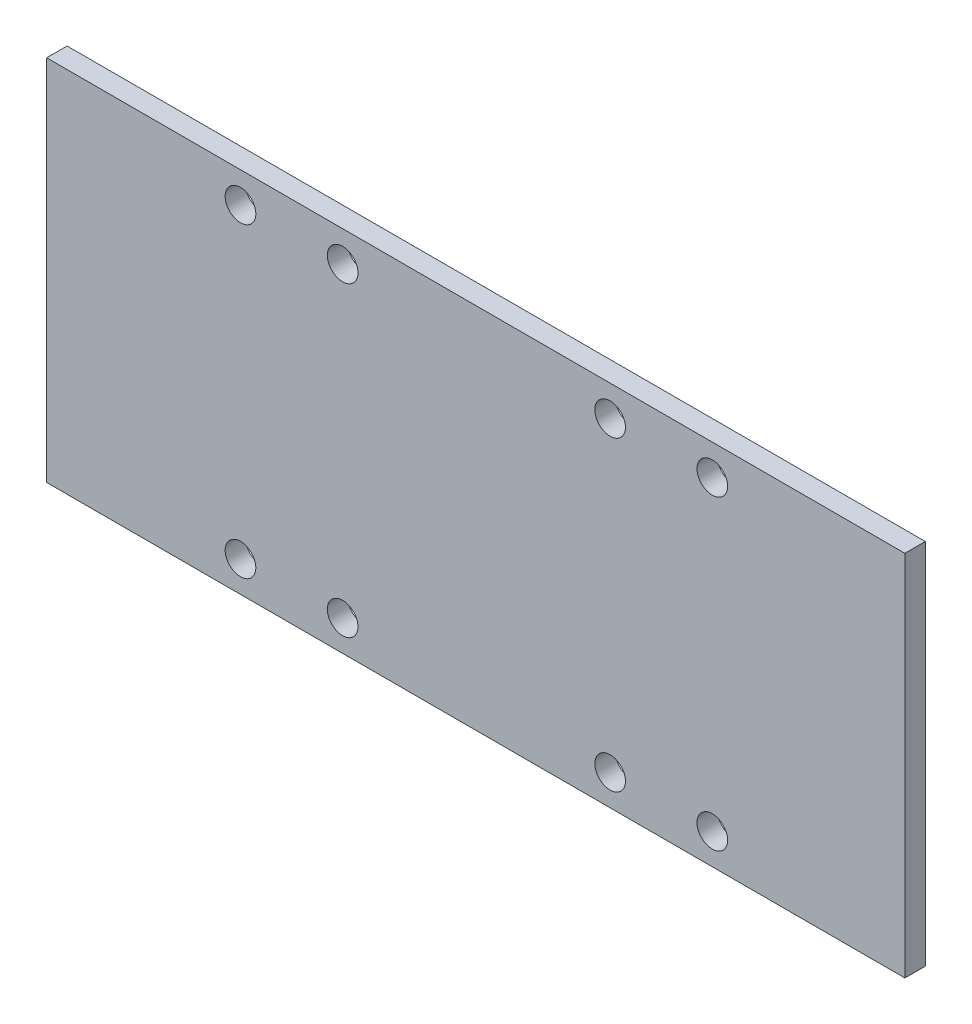
ISO-10303-21;
HEADER;
FILE_DESCRIPTION(('STEP AP214'),'2;1');
FILE_NAME('part.step','',(''),(''),'','','');
FILE_SCHEMA(('AUTOMOTIVE_DESIGN { 1 0 10303 214 1 1 1 1 }'));
ENDSEC;
DATA;
#1=APPLICATION_CONTEXT('core data for automotive mechanical design processes');
#2=APPLICATION_PROTOCOL_DEFINITION('international standard','automotive_design',2000,#1);
#3=PRODUCT_CONTEXT('',#1,'mechanical');
#4=PRODUCT('Part','Part','',(#3));
#5=PRODUCT_RELATED_PRODUCT_CATEGORY('part','',(#4));
#6=PRODUCT_DEFINITION_FORMATION('','',#4);
#7=PRODUCT_DEFINITION_CONTEXT('part definition',#1,'design');
#8=PRODUCT_DEFINITION('design','',#6,#7);
#9=PRODUCT_DEFINITION_SHAPE('','',#8);
#10=(LENGTH_UNIT() NAMED_UNIT(*) SI_UNIT(.MILLI.,.METRE.));
#11=(NAMED_UNIT(*) PLANE_ANGLE_UNIT() SI_UNIT($,.RADIAN.));
#12=(NAMED_UNIT(*) SI_UNIT($,.STERADIAN.) SOLID_ANGLE_UNIT());
#13=UNCERTAINTY_MEASURE_WITH_UNIT(LENGTH_MEASURE(1.E-05),#10,'distance_accuracy_value','');
#14=(GEOMETRIC_REPRESENTATION_CONTEXT(3) GLOBAL_UNCERTAINTY_ASSIGNED_CONTEXT((#13)) GLOBAL_UNIT_ASSIGNED_CONTEXT((#10,
#11,#12)) REPRESENTATION_CONTEXT('',''));
#15=CARTESIAN_POINT('',(0.,0.,0.));
#16=DIRECTION('',(0.,0.,1.));
#17=DIRECTION('',(1.,0.,0.));
#18=AXIS2_PLACEMENT_3D('',#15,#16,#17);
#19=CARTESIAN_POINT('',(42.,18.,2.));
#20=DIRECTION('',(-1.,0.,0.));
#21=DIRECTION('',(0.,-1.,0.));
#22=AXIS2_PLACEMENT_3D('',#19,#20,#21);
#23=PLANE('',#22);
#24=DIRECTION('',(0.,1.,0.));
#25=VECTOR('',#24,1.);
#26=CARTESIAN_POINT('',(42.,18.,0.));
#27=LINE('',#26,#25);
#28=CARTESIAN_POINT('',(42.,-18.,0.));
#29=VERTEX_POINT('',#28);
#30=CARTESIAN_POINT('',(42.,18.,0.));
#31=VERTEX_POINT('',#30);
#32=EDGE_CURVE('E104',#29,#31,#27,.T.);
#33=ORIENTED_EDGE('',*,*,#32,.T.);
#34=DIRECTION('',(0.,0.,-1.));
#35=VECTOR('',#34,1.);
#36=CARTESIAN_POINT('',(42.,18.,2.));
#37=LINE('',#36,#35);
#38=CARTESIAN_POINT('',(42.,18.,2.));
#39=VERTEX_POINT('',#38);
#40=EDGE_CURVE('E11',#39,#31,#37,.T.);
#41=ORIENTED_EDGE('',*,*,#40,.F.);
#42=DIRECTION('',(0.,1.,0.));
#43=VECTOR('',#42,1.);
#44=CARTESIAN_POINT('',(42.,18.,2.));
#45=LINE('',#44,#43);
#46=CARTESIAN_POINT('',(42.,-18.,2.));
#47=VERTEX_POINT('',#46);
#48=EDGE_CURVE('E92',#47,#39,#45,.T.);
#49=ORIENTED_EDGE('',*,*,#48,.F.);
#50=DIRECTION('',(0.,0.,-1.));
#51=VECTOR('',#50,1.);
#52=CARTESIAN_POINT('',(42.,-18.,2.));
#53=LINE('',#52,#51);
#54=EDGE_CURVE('E100',#47,#29,#53,.T.);
#55=ORIENTED_EDGE('',*,*,#54,.T.);
#56=EDGE_LOOP('',(#33,#41,#49,#55));
#57=FACE_BOUND('',#56,.T.);
#58=ADVANCED_FACE('F41',(#57),#23,.F.);
#59=CARTESIAN_POINT('',(-42.,18.,2.));
#60=DIRECTION('',(0.,-1.,0.));
#61=DIRECTION('',(0.,0.,-1.));
#62=AXIS2_PLACEMENT_3D('',#59,#60,#61);
#63=PLANE('',#62);
#64=DIRECTION('',(-1.,0.,0.));
#65=VECTOR('',#64,1.);
#66=CARTESIAN_POINT('',(-42.,18.,0.));
#67=LINE('',#66,#65);
#68=CARTESIAN_POINT('',(-42.,18.,0.));
#69=VERTEX_POINT('',#68);
#70=EDGE_CURVE('E96',#31,#69,#67,.T.);
#71=ORIENTED_EDGE('',*,*,#70,.T.);
#72=DIRECTION('',(0.,0.,-1.));
#73=VECTOR('',#72,1.);
#74=CARTESIAN_POINT('',(-42.,18.,2.));
#75=LINE('',#74,#73);
#76=CARTESIAN_POINT('',(-42.,18.,2.));
#77=VERTEX_POINT('',#76);
#78=EDGE_CURVE('E49',#77,#69,#75,.T.);
#79=ORIENTED_EDGE('',*,*,#78,.F.);
#80=DIRECTION('',(-1.,0.,0.));
#81=VECTOR('',#80,1.);
#82=CARTESIAN_POINT('',(-42.,18.,2.));
#83=LINE('',#82,#81);
#84=EDGE_CURVE('E87',#39,#77,#83,.T.);
#85=ORIENTED_EDGE('',*,*,#84,.F.);
#86=ORIENTED_EDGE('',*,*,#40,.T.);
#87=EDGE_LOOP('',(#71,#79,#85,#86));
#88=FACE_BOUND('',#87,.T.);
#89=ADVANCED_FACE('F95',(#88),#63,.F.);
#90=CARTESIAN_POINT('',(-42.,18.,2.));
#91=DIRECTION('',(1.,0.,0.));
#92=DIRECTION('',(0.,1.,0.));
#93=AXIS2_PLACEMENT_3D('',#90,#91,#92);
#94=PLANE('',#93);
#95=DIRECTION('',(0.,-1.,0.));
#96=VECTOR('',#95,1.);
#97=CARTESIAN_POINT('',(-42.,18.,0.));
#98=LINE('',#97,#96);
#99=CARTESIAN_POINT('',(-42.,-18.,0.));
#100=VERTEX_POINT('',#99);
#101=EDGE_CURVE('E74',#69,#100,#98,.T.);
#102=ORIENTED_EDGE('',*,*,#101,.T.);
#103=DIRECTION('',(0.,0.,-1.));
#104=VECTOR('',#103,1.);
#105=CARTESIAN_POINT('',(-42.,-18.,2.));
#106=LINE('',#105,#104);
#107=CARTESIAN_POINT('',(-42.,-18.,2.));
#108=VERTEX_POINT('',#107);
#109=EDGE_CURVE('E97',#108,#100,#106,.T.);
#110=ORIENTED_EDGE('',*,*,#109,.F.);
#111=DIRECTION('',(0.,-1.,0.));
#112=VECTOR('',#111,1.);
#113=CARTESIAN_POINT('',(-42.,18.,2.));
#114=LINE('',#113,#112);
#115=EDGE_CURVE('E90',#77,#108,#114,.T.);
#116=ORIENTED_EDGE('',*,*,#115,.F.);
#117=ORIENTED_EDGE('',*,*,#78,.T.);
#118=EDGE_LOOP('',(#102,#110,#116,#117));
#119=FACE_BOUND('',#118,.T.);
#120=ADVANCED_FACE('F98',(#119),#94,.F.);
#121=CARTESIAN_POINT('',(-42.,-18.,2.));
#122=DIRECTION('',(0.,1.,0.));
#123=DIRECTION('',(0.,0.,1.));
#124=AXIS2_PLACEMENT_3D('',#121,#122,#123);
#125=PLANE('',#124);
#126=DIRECTION('',(1.,0.,0.));
#127=VECTOR('',#126,1.);
#128=CARTESIAN_POINT('',(-42.,-18.,0.));
#129=LINE('',#128,#127);
#130=EDGE_CURVE('E80',#100,#29,#129,.T.);
#131=ORIENTED_EDGE('',*,*,#130,.T.);
#132=ORIENTED_EDGE('',*,*,#54,.F.);
#133=DIRECTION('',(1.,0.,0.));
#134=VECTOR('',#133,1.);
#135=CARTESIAN_POINT('',(-42.,-18.,2.));
#136=LINE('',#135,#134);
#137=EDGE_CURVE('E57',#108,#47,#136,.T.);
#138=ORIENTED_EDGE('',*,*,#137,.F.);
#139=ORIENTED_EDGE('',*,*,#109,.T.);
#140=EDGE_LOOP('',(#131,#132,#138,#139));
#141=FACE_BOUND('',#140,.T.);
#142=ADVANCED_FACE('F112',(#141),#125,.F.);
#143=CARTESIAN_POINT('',(0.,0.,2.));
#144=DIRECTION('',(0.,0.,1.));
#145=DIRECTION('',(1.,0.,0.));
#146=AXIS2_PLACEMENT_3D('',#143,#144,#145);
#147=PLANE('',#146);
#148=CARTESIAN_POINT('',(13.15,-15.,2.));
#149=DIRECTION('',(0.,0.,1.));
#150=DIRECTION('',(1.,0.,0.));
#151=AXIS2_PLACEMENT_3D('',#148,#149,#150);
#152=CIRCLE('',#151,1.5);
#153=CARTESIAN_POINT('',(14.65,-15.,2.));
#154=VERTEX_POINT('',#153);
#155=EDGE_CURVE('E121',#154,#154,#152,.T.);
#156=ORIENTED_EDGE('',*,*,#155,.F.);
#157=EDGE_LOOP('',(#156));
#158=FACE_BOUND('',#157,.T.);
#159=CARTESIAN_POINT('',(-13.03,-15.,2.));
#160=DIRECTION('',(0.,0.,1.));
#161=DIRECTION('',(1.,0.,0.));
#162=AXIS2_PLACEMENT_3D('',#159,#160,#161);
#163=CIRCLE('',#162,1.5);
#164=CARTESIAN_POINT('',(-11.53,-15.,2.));
#165=VERTEX_POINT('',#164);
#166=EDGE_CURVE('E140',#165,#165,#163,.T.);
#167=ORIENTED_EDGE('',*,*,#166,.F.);
#168=EDGE_LOOP('',(#167));
#169=FACE_BOUND('',#168,.T.);
#170=CARTESIAN_POINT('',(-23.03,-15.,2.));
#171=DIRECTION('',(0.,0.,1.));
#172=DIRECTION('',(1.,0.,0.));
#173=AXIS2_PLACEMENT_3D('',#170,#171,#172);
#174=CIRCLE('',#173,1.5);
#175=CARTESIAN_POINT('',(-21.53,-15.,2.));
#176=VERTEX_POINT('',#175);
#177=EDGE_CURVE('E134',#176,#176,#174,.T.);
#178=ORIENTED_EDGE('',*,*,#177,.F.);
#179=EDGE_LOOP('',(#178));
#180=FACE_BOUND('',#179,.T.);
#181=CARTESIAN_POINT('',(-23.03,15.,2.));
#182=DIRECTION('',(0.,0.,1.));
#183=DIRECTION('',(-1.,0.,0.));
#184=AXIS2_PLACEMENT_3D('',#181,#182,#183);
#185=CIRCLE('',#184,1.5);
#186=CARTESIAN_POINT('',(-24.53,15.,2.));
#187=VERTEX_POINT('',#186);
#188=EDGE_CURVE('E127',#187,#187,#185,.T.);
#189=ORIENTED_EDGE('',*,*,#188,.F.);
#190=EDGE_LOOP('',(#189));
#191=FACE_BOUND('',#190,.T.);
#192=CARTESIAN_POINT('',(-13.03,15.,2.));
#193=DIRECTION('',(0.,0.,1.));
#194=DIRECTION('',(-1.,0.,0.));
#195=AXIS2_PLACEMENT_3D('',#192,#193,#194);
#196=CIRCLE('',#195,1.5);
#197=CARTESIAN_POINT('',(-14.53,15.,2.));
#198=VERTEX_POINT('',#197);
#199=EDGE_CURVE('E128',#198,#198,#196,.T.);
#200=ORIENTED_EDGE('',*,*,#199,.F.);
#201=EDGE_LOOP('',(#200));
#202=FACE_BOUND('',#201,.T.);
#203=CARTESIAN_POINT('',(13.15,15.,2.));
#204=DIRECTION('',(0.,0.,1.));
#205=DIRECTION('',(-1.,0.,0.));
#206=AXIS2_PLACEMENT_3D('',#203,#204,#205);
#207=CIRCLE('',#206,1.5);
#208=CARTESIAN_POINT('',(11.65,15.,2.));
#209=VERTEX_POINT('',#208);
#210=EDGE_CURVE('E157',#209,#209,#207,.T.);
#211=ORIENTED_EDGE('',*,*,#210,.F.);
#212=EDGE_LOOP('',(#211));
#213=FACE_BOUND('',#212,.T.);
#214=CARTESIAN_POINT('',(23.15,15.,2.));
#215=DIRECTION('',(0.,0.,1.));
#216=DIRECTION('',(-1.,0.,0.));
#217=AXIS2_PLACEMENT_3D('',#214,#215,#216);
#218=CIRCLE('',#217,1.5);
#219=CARTESIAN_POINT('',(21.65,15.,2.));
#220=VERTEX_POINT('',#219);
#221=EDGE_CURVE('E151',#220,#220,#218,.T.);
#222=ORIENTED_EDGE('',*,*,#221,.F.);
#223=EDGE_LOOP('',(#222));
#224=FACE_BOUND('',#223,.T.);
#225=CARTESIAN_POINT('',(23.15,-15.,2.));
#226=DIRECTION('',(0.,0.,1.));
#227=DIRECTION('',(1.,0.,0.));
#228=AXIS2_PLACEMENT_3D('',#225,#226,#227);
#229=CIRCLE('',#228,1.5);
#230=CARTESIAN_POINT('',(24.65,-15.,2.));
#231=VERTEX_POINT('',#230);
#232=EDGE_CURVE('E118',#231,#231,#229,.T.);
#233=ORIENTED_EDGE('',*,*,#232,.F.);
#234=EDGE_LOOP('',(#233));
#235=FACE_BOUND('',#234,.T.);
#236=ORIENTED_EDGE('',*,*,#48,.T.);
#237=ORIENTED_EDGE('',*,*,#84,.T.);
#238=ORIENTED_EDGE('',*,*,#115,.T.);
#239=ORIENTED_EDGE('',*,*,#137,.T.);
#240=EDGE_LOOP('',(#236,#237,#238,#239));
#241=FACE_BOUND('',#240,.T.);
#242=ADVANCED_FACE('F88',(#158,#169,#180,#191,#202,#213,#224,#235,#241),#147,.T.);
#243=CARTESIAN_POINT('',(0.,0.,0.));
#244=DIRECTION('',(0.,0.,1.));
#245=DIRECTION('',(1.,0.,0.));
#246=AXIS2_PLACEMENT_3D('',#243,#244,#245);
#247=PLANE('',#246);
#248=CARTESIAN_POINT('',(13.15,-15.,0.));
#249=DIRECTION('',(0.,0.,1.));
#250=DIRECTION('',(1.,0.,0.));
#251=AXIS2_PLACEMENT_3D('',#248,#249,#250);
#252=CIRCLE('',#251,1.5);
#253=CARTESIAN_POINT('',(14.65,-15.,0.));
#254=VERTEX_POINT('',#253);
#255=EDGE_CURVE('E143',#254,#254,#252,.T.);
#256=ORIENTED_EDGE('',*,*,#255,.T.);
#257=EDGE_LOOP('',(#256));
#258=FACE_BOUND('',#257,.T.);
#259=CARTESIAN_POINT('',(-13.03,-15.,0.));
#260=DIRECTION('',(0.,0.,1.));
#261=DIRECTION('',(1.,0.,0.));
#262=AXIS2_PLACEMENT_3D('',#259,#260,#261);
#263=CIRCLE('',#262,1.5);
#264=CARTESIAN_POINT('',(-11.53,-15.,0.));
#265=VERTEX_POINT('',#264);
#266=EDGE_CURVE('E137',#265,#265,#263,.T.);
#267=ORIENTED_EDGE('',*,*,#266,.T.);
#268=EDGE_LOOP('',(#267));
#269=FACE_BOUND('',#268,.T.);
#270=CARTESIAN_POINT('',(-23.03,-15.,0.));
#271=DIRECTION('',(0.,0.,1.));
#272=DIRECTION('',(1.,0.,0.));
#273=AXIS2_PLACEMENT_3D('',#270,#271,#272);
#274=CIRCLE('',#273,1.5);
#275=CARTESIAN_POINT('',(-21.53,-15.,0.));
#276=VERTEX_POINT('',#275);
#277=EDGE_CURVE('E131',#276,#276,#274,.T.);
#278=ORIENTED_EDGE('',*,*,#277,.T.);
#279=EDGE_LOOP('',(#278));
#280=FACE_BOUND('',#279,.T.);
#281=CARTESIAN_POINT('',(-23.03,15.,0.));
#282=DIRECTION('',(0.,0.,1.));
#283=DIRECTION('',(-1.,0.,0.));
#284=AXIS2_PLACEMENT_3D('',#281,#282,#283);
#285=CIRCLE('',#284,1.5);
#286=CARTESIAN_POINT('',(-24.53,15.,0.));
#287=VERTEX_POINT('',#286);
#288=EDGE_CURVE('E124',#287,#287,#285,.T.);
#289=ORIENTED_EDGE('',*,*,#288,.T.);
#290=EDGE_LOOP('',(#289));
#291=FACE_BOUND('',#290,.T.);
#292=CARTESIAN_POINT('',(-13.03,15.,0.));
#293=DIRECTION('',(0.,0.,1.));
#294=DIRECTION('',(-1.,0.,0.));
#295=AXIS2_PLACEMENT_3D('',#292,#293,#294);
#296=CIRCLE('',#295,1.5);
#297=CARTESIAN_POINT('',(-14.53,15.,0.));
#298=VERTEX_POINT('',#297);
#299=EDGE_CURVE('E160',#298,#298,#296,.T.);
#300=ORIENTED_EDGE('',*,*,#299,.T.);
#301=EDGE_LOOP('',(#300));
#302=FACE_BOUND('',#301,.T.);
#303=CARTESIAN_POINT('',(13.15,15.,0.));
#304=DIRECTION('',(0.,0.,1.));
#305=DIRECTION('',(-1.,0.,0.));
#306=AXIS2_PLACEMENT_3D('',#303,#304,#305);
#307=CIRCLE('',#306,1.5);
#308=CARTESIAN_POINT('',(11.65,15.,0.));
#309=VERTEX_POINT('',#308);
#310=EDGE_CURVE('E154',#309,#309,#307,.T.);
#311=ORIENTED_EDGE('',*,*,#310,.T.);
#312=EDGE_LOOP('',(#311));
#313=FACE_BOUND('',#312,.T.);
#314=CARTESIAN_POINT('',(23.15,15.,0.));
#315=DIRECTION('',(0.,0.,1.));
#316=DIRECTION('',(-1.,0.,0.));
#317=AXIS2_PLACEMENT_3D('',#314,#315,#316);
#318=CIRCLE('',#317,1.5);
#319=CARTESIAN_POINT('',(21.65,15.,0.));
#320=VERTEX_POINT('',#319);
#321=EDGE_CURVE('E148',#320,#320,#318,.T.);
#322=ORIENTED_EDGE('',*,*,#321,.T.);
#323=EDGE_LOOP('',(#322));
#324=FACE_BOUND('',#323,.T.);
#325=CARTESIAN_POINT('',(23.15,-15.,0.));
#326=DIRECTION('',(0.,0.,1.));
#327=DIRECTION('',(1.,0.,0.));
#328=AXIS2_PLACEMENT_3D('',#325,#326,#327);
#329=CIRCLE('',#328,1.5);
#330=CARTESIAN_POINT('',(24.65,-15.,0.));
#331=VERTEX_POINT('',#330);
#332=EDGE_CURVE('E107',#331,#331,#329,.T.);
#333=ORIENTED_EDGE('',*,*,#332,.T.);
#334=EDGE_LOOP('',(#333));
#335=FACE_BOUND('',#334,.T.);
#336=ORIENTED_EDGE('',*,*,#32,.F.);
#337=ORIENTED_EDGE('',*,*,#130,.F.);
#338=ORIENTED_EDGE('',*,*,#101,.F.);
#339=ORIENTED_EDGE('',*,*,#70,.F.);
#340=EDGE_LOOP('',(#336,#337,#338,#339));
#341=FACE_BOUND('',#340,.T.);
#342=ADVANCED_FACE('F115',(#258,#269,#280,#291,#302,#313,#324,#335,#341),#247,.F.);
#343=CARTESIAN_POINT('',(23.15,-15.,0.));
#344=DIRECTION('',(0.,0.,1.));
#345=DIRECTION('',(1.,0.,0.));
#346=AXIS2_PLACEMENT_3D('',#343,#344,#345);
#347=CYLINDRICAL_SURFACE('',#346,1.5);
#348=ORIENTED_EDGE('',*,*,#332,.F.);
#349=EDGE_LOOP('',(#348));
#350=FACE_BOUND('',#349,.T.);
#351=ORIENTED_EDGE('',*,*,#232,.T.);
#352=EDGE_LOOP('',(#351));
#353=FACE_BOUND('',#352,.T.);
#354=ADVANCED_FACE('F178',(#350,#353),#347,.F.);
#355=CARTESIAN_POINT('',(23.15,15.,0.));
#356=DIRECTION('',(0.,0.,1.));
#357=DIRECTION('',(1.,0.,0.));
#358=AXIS2_PLACEMENT_3D('',#355,#356,#357);
#359=CYLINDRICAL_SURFACE('',#358,1.5);
#360=ORIENTED_EDGE('',*,*,#321,.F.);
#361=EDGE_LOOP('',(#360));
#362=FACE_BOUND('',#361,.T.);
#363=ORIENTED_EDGE('',*,*,#221,.T.);
#364=EDGE_LOOP('',(#363));
#365=FACE_BOUND('',#364,.T.);
#366=ADVANCED_FACE('F180',(#362,#365),#359,.F.);
#367=CARTESIAN_POINT('',(13.15,15.,0.));
#368=DIRECTION('',(0.,0.,1.));
#369=DIRECTION('',(1.,0.,0.));
#370=AXIS2_PLACEMENT_3D('',#367,#368,#369);
#371=CYLINDRICAL_SURFACE('',#370,1.5);
#372=ORIENTED_EDGE('',*,*,#310,.F.);
#373=EDGE_LOOP('',(#372));
#374=FACE_BOUND('',#373,.T.);
#375=ORIENTED_EDGE('',*,*,#210,.T.);
#376=EDGE_LOOP('',(#375));
#377=FACE_BOUND('',#376,.T.);
#378=ADVANCED_FACE('F187',(#374,#377),#371,.F.);
#379=CARTESIAN_POINT('',(-13.03,15.,0.));
#380=DIRECTION('',(0.,0.,1.));
#381=DIRECTION('',(1.,0.,0.));
#382=AXIS2_PLACEMENT_3D('',#379,#380,#381);
#383=CYLINDRICAL_SURFACE('',#382,1.5);
#384=ORIENTED_EDGE('',*,*,#299,.F.);
#385=EDGE_LOOP('',(#384));
#386=FACE_BOUND('',#385,.T.);
#387=ORIENTED_EDGE('',*,*,#199,.T.);
#388=EDGE_LOOP('',(#387));
#389=FACE_BOUND('',#388,.T.);
#390=ADVANCED_FACE('F166',(#386,#389),#383,.F.);
#391=CARTESIAN_POINT('',(-23.03,15.,0.));
#392=DIRECTION('',(0.,0.,1.));
#393=DIRECTION('',(1.,0.,0.));
#394=AXIS2_PLACEMENT_3D('',#391,#392,#393);
#395=CYLINDRICAL_SURFACE('',#394,1.5);
#396=ORIENTED_EDGE('',*,*,#288,.F.);
#397=EDGE_LOOP('',(#396));
#398=FACE_BOUND('',#397,.T.);
#399=ORIENTED_EDGE('',*,*,#188,.T.);
#400=EDGE_LOOP('',(#399));
#401=FACE_BOUND('',#400,.T.);
#402=ADVANCED_FACE('F248',(#398,#401),#395,.F.);
#403=CARTESIAN_POINT('',(-23.03,-15.,0.));
#404=DIRECTION('',(0.,0.,1.));
#405=DIRECTION('',(1.,0.,0.));
#406=AXIS2_PLACEMENT_3D('',#403,#404,#405);
#407=CYLINDRICAL_SURFACE('',#406,1.5);
#408=ORIENTED_EDGE('',*,*,#277,.F.);
#409=EDGE_LOOP('',(#408));
#410=FACE_BOUND('',#409,.T.);
#411=ORIENTED_EDGE('',*,*,#177,.T.);
#412=EDGE_LOOP('',(#411));
#413=FACE_BOUND('',#412,.T.);
#414=ADVANCED_FACE('F259',(#410,#413),#407,.F.);
#415=CARTESIAN_POINT('',(-13.03,-15.,0.));
#416=DIRECTION('',(0.,0.,1.));
#417=DIRECTION('',(1.,0.,0.));
#418=AXIS2_PLACEMENT_3D('',#415,#416,#417);
#419=CYLINDRICAL_SURFACE('',#418,1.5);
#420=ORIENTED_EDGE('',*,*,#266,.F.);
#421=EDGE_LOOP('',(#420));
#422=FACE_BOUND('',#421,.T.);
#423=ORIENTED_EDGE('',*,*,#166,.T.);
#424=EDGE_LOOP('',(#423));
#425=FACE_BOUND('',#424,.T.);
#426=ADVANCED_FACE('F269',(#422,#425),#419,.F.);
#427=CARTESIAN_POINT('',(13.15,-15.,0.));
#428=DIRECTION('',(0.,0.,1.));
#429=DIRECTION('',(1.,0.,0.));
#430=AXIS2_PLACEMENT_3D('',#427,#428,#429);
#431=CYLINDRICAL_SURFACE('',#430,1.5);
#432=ORIENTED_EDGE('',*,*,#255,.F.);
#433=EDGE_LOOP('',(#432));
#434=FACE_BOUND('',#433,.T.);
#435=ORIENTED_EDGE('',*,*,#155,.T.);
#436=EDGE_LOOP('',(#435));
#437=FACE_BOUND('',#436,.T.);
#438=ADVANCED_FACE('F280',(#434,#437),#431,.F.);
#439=CLOSED_SHELL('',(#58,#89,#120,#142,#242,#342,#354,#366,#378,#390,#402,#414,#426,#438));
#440=MANIFOLD_SOLID_BREP('B2',#439);
#441=ADVANCED_BREP_SHAPE_REPRESENTATION('',(#18,#440),#14);
#442=SHAPE_DEFINITION_REPRESENTATION(#9,#441);
ENDSEC;
END-ISO-10303-21;
